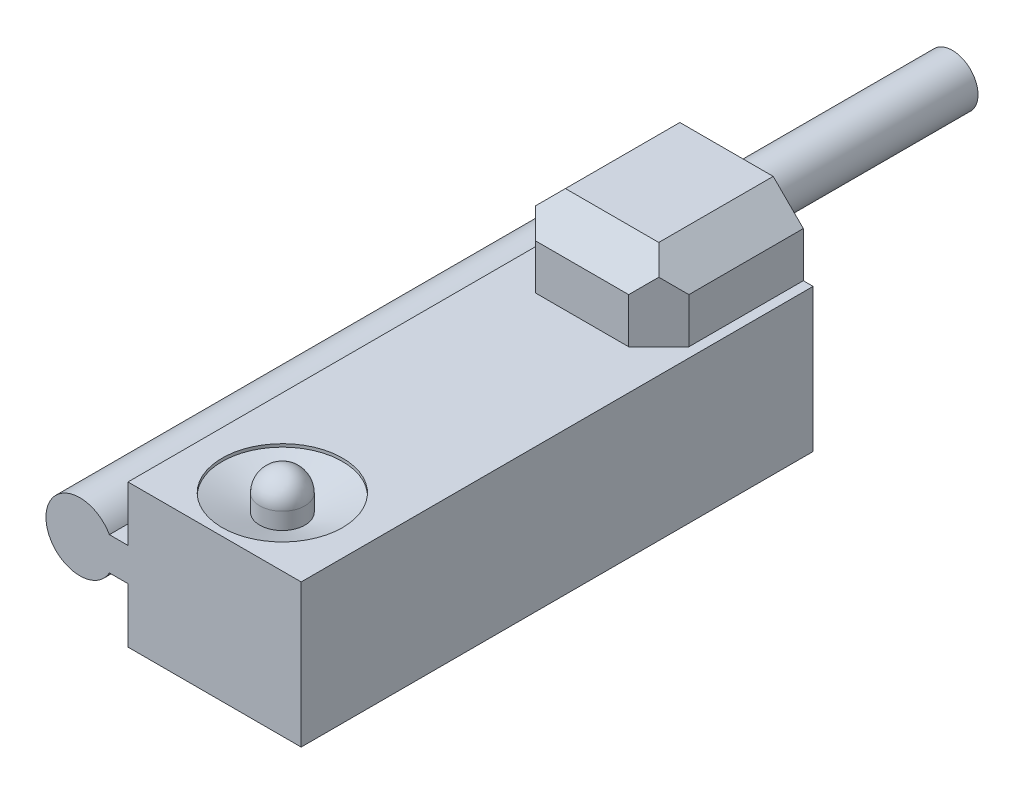
ISO-10303-21;
HEADER;
FILE_DESCRIPTION(('STEP AP214'),'2;1');
FILE_NAME('part.step','',(''),(''),'','','');
FILE_SCHEMA(('AUTOMOTIVE_DESIGN { 1 0 10303 214 1 1 1 1 }'));
ENDSEC;
DATA;
#1=APPLICATION_CONTEXT('core data for automotive mechanical design processes');
#2=APPLICATION_PROTOCOL_DEFINITION('international standard','automotive_design',2000,#1);
#3=PRODUCT_CONTEXT('',#1,'mechanical');
#4=PRODUCT('Part','Part','',(#3));
#5=PRODUCT_RELATED_PRODUCT_CATEGORY('part','',(#4));
#6=PRODUCT_DEFINITION_FORMATION('','',#4);
#7=PRODUCT_DEFINITION_CONTEXT('part definition',#1,'design');
#8=PRODUCT_DEFINITION('design','',#6,#7);
#9=PRODUCT_DEFINITION_SHAPE('','',#8);
#10=(LENGTH_UNIT() NAMED_UNIT(*) SI_UNIT(.MILLI.,.METRE.));
#11=(NAMED_UNIT(*) PLANE_ANGLE_UNIT() SI_UNIT($,.RADIAN.));
#12=(NAMED_UNIT(*) SI_UNIT($,.STERADIAN.) SOLID_ANGLE_UNIT());
#13=UNCERTAINTY_MEASURE_WITH_UNIT(LENGTH_MEASURE(1.E-05),#10,'distance_accuracy_value','');
#14=(GEOMETRIC_REPRESENTATION_CONTEXT(3) GLOBAL_UNCERTAINTY_ASSIGNED_CONTEXT((#13)) GLOBAL_UNIT_ASSIGNED_CONTEXT((#10,
#11,#12)) REPRESENTATION_CONTEXT('',''));
#15=CARTESIAN_POINT('',(0.,0.,0.));
#16=DIRECTION('',(0.,0.,1.));
#17=DIRECTION('',(1.,0.,0.));
#18=AXIS2_PLACEMENT_3D('',#15,#16,#17);
#19=CARTESIAN_POINT('',(-3.025,2.25,24.5));
#20=DIRECTION('',(0.,-1.,0.));
#21=DIRECTION('',(0.,0.,-1.));
#22=AXIS2_PLACEMENT_3D('',#19,#20,#21);
#23=PLANE('',#22);
#24=CARTESIAN_POINT('',(2.725,2.25,20.));
#25=DIRECTION('',(0.,-1.,0.));
#26=DIRECTION('',(0.,0.,-1.));
#27=AXIS2_PLACEMENT_3D('',#24,#25,#26);
#28=CIRCLE('',#27,4.);
#29=CARTESIAN_POINT('',(6.725,2.25,20.));
#30=VERTEX_POINT('',#29);
#31=EDGE_CURVE('E248',#30,#30,#28,.T.);
#32=ORIENTED_EDGE('',*,*,#31,.T.);
#33=EDGE_LOOP('',(#32));
#34=FACE_BOUND('',#33,.T.);
#35=DIRECTION('',(0.,0.,1.));
#36=VECTOR('',#35,1.);
#37=CARTESIAN_POINT('',(-2.375,2.25,-9.5));
#38=LINE('',#37,#36);
#39=CARTESIAN_POINT('',(-2.375,2.25,-9.5));
#40=VERTEX_POINT('',#39);
#41=CARTESIAN_POINT('',(-2.375,2.25,-1.9));
#42=VERTEX_POINT('',#41);
#43=EDGE_CURVE('E267',#40,#42,#38,.T.);
#44=ORIENTED_EDGE('',*,*,#43,.F.);
#45=DIRECTION('',(-1.,0.,0.));
#46=VECTOR('',#45,1.);
#47=CARTESIAN_POINT('',(-3.025,2.25,-9.5));
#48=LINE('',#47,#46);
#49=CARTESIAN_POINT('',(-3.025,2.25,-9.5));
#50=VERTEX_POINT('',#49);
#51=EDGE_CURVE('E289',#40,#50,#48,.T.);
#52=ORIENTED_EDGE('',*,*,#51,.T.);
#53=DIRECTION('',(0.,0.,-1.));
#54=VECTOR('',#53,1.);
#55=CARTESIAN_POINT('',(-3.025,2.25,24.5));
#56=LINE('',#55,#54);
#57=CARTESIAN_POINT('',(-3.025,2.25,24.5));
#58=VERTEX_POINT('',#57);
#59=EDGE_CURVE('E11',#58,#50,#56,.T.);
#60=ORIENTED_EDGE('',*,*,#59,.F.);
#61=DIRECTION('',(-1.,0.,0.));
#62=VECTOR('',#61,1.);
#63=CARTESIAN_POINT('',(-3.025,2.25,24.5));
#64=LINE('',#63,#62);
#65=CARTESIAN_POINT('',(8.475,2.25,24.5));
#66=VERTEX_POINT('',#65);
#67=EDGE_CURVE('E335',#66,#58,#64,.T.);
#68=ORIENTED_EDGE('',*,*,#67,.F.);
#69=DIRECTION('',(0.,0.,-1.));
#70=VECTOR('',#69,1.);
#71=CARTESIAN_POINT('',(8.475,2.25,24.5));
#72=LINE('',#71,#70);
#73=CARTESIAN_POINT('',(8.475,2.25,-9.5));
#74=VERTEX_POINT('',#73);
#75=EDGE_CURVE('E45',#66,#74,#72,.T.);
#76=ORIENTED_EDGE('',*,*,#75,.T.);
#77=DIRECTION('',(-1.,0.,0.));
#78=VECTOR('',#77,1.);
#79=CARTESIAN_POINT('',(-3.025,2.25,-9.5));
#80=LINE('',#79,#78);
#81=CARTESIAN_POINT('',(7.825,2.25,-9.5));
#82=VERTEX_POINT('',#81);
#83=EDGE_CURVE('E191',#74,#82,#80,.T.);
#84=ORIENTED_EDGE('',*,*,#83,.T.);
#85=DIRECTION('',(0.,0.,-1.));
#86=VECTOR('',#85,1.);
#87=CARTESIAN_POINT('',(7.825,2.25,-9.5));
#88=LINE('',#87,#86);
#89=CARTESIAN_POINT('',(7.825,2.25,-1.9));
#90=VERTEX_POINT('',#89);
#91=EDGE_CURVE('E177',#90,#82,#88,.T.);
#92=ORIENTED_EDGE('',*,*,#91,.F.);
#93=DIRECTION('',(-0.707106781186548,0.,0.707106781186547));
#94=VECTOR('',#93,1.);
#95=CARTESIAN_POINT('',(-10.8,2.25,16.725));
#96=LINE('',#95,#94);
#97=CARTESIAN_POINT('',(5.825,2.25,0.1));
#98=VERTEX_POINT('',#97);
#99=EDGE_CURVE('E504',#90,#98,#96,.T.);
#100=ORIENTED_EDGE('',*,*,#99,.T.);
#101=DIRECTION('',(1.,0.,0.));
#102=VECTOR('',#101,1.);
#103=CARTESIAN_POINT('',(-2.375,2.25,0.1));
#104=LINE('',#103,#102);
#105=CARTESIAN_POINT('',(-0.375,2.25,0.1));
#106=VERTEX_POINT('',#105);
#107=EDGE_CURVE('E164',#106,#98,#104,.T.);
#108=ORIENTED_EDGE('',*,*,#107,.F.);
#109=DIRECTION('',(-0.707106781186547,0.,-0.707106781186548));
#110=VECTOR('',#109,1.);
#111=CARTESIAN_POINT('',(10.5,2.25,10.975));
#112=LINE('',#111,#110);
#113=EDGE_CURVE('E222',#106,#42,#112,.T.);
#114=ORIENTED_EDGE('',*,*,#113,.T.);
#115=EDGE_LOOP('',(#44,#52,#60,#68,#76,#84,#92,#100,#108,#114));
#116=FACE_BOUND('',#115,.T.);
#117=ADVANCED_FACE('F19',(#34,#116),#23,.F.);
#118=CARTESIAN_POINT('',(-4.26222135736095,-1.4,24.5));
#119=DIRECTION('',(0.,-1.,0.));
#120=DIRECTION('',(0.,0.,-1.));
#121=AXIS2_PLACEMENT_3D('',#118,#119,#120);
#122=PLANE('',#121);
#123=DIRECTION('',(1.,0.,0.));
#124=VECTOR('',#123,1.);
#125=CARTESIAN_POINT('',(-3.025,-1.4,19.5));
#126=LINE('',#125,#124);
#127=CARTESIAN_POINT('',(-4.26222135736095,-1.4,19.5));
#128=VERTEX_POINT('',#127);
#129=CARTESIAN_POINT('',(-3.025,-1.4,19.5));
#130=VERTEX_POINT('',#129);
#131=EDGE_CURVE('E257',#128,#130,#126,.T.);
#132=ORIENTED_EDGE('',*,*,#131,.F.);
#133=DIRECTION('',(0.,0.,-1.));
#134=VECTOR('',#133,1.);
#135=CARTESIAN_POINT('',(-4.26222135736095,-1.4,24.5));
#136=LINE('',#135,#134);
#137=CARTESIAN_POINT('',(-4.26222135736095,-1.4,24.5));
#138=VERTEX_POINT('',#137);
#139=EDGE_CURVE('E241',#138,#128,#136,.T.);
#140=ORIENTED_EDGE('',*,*,#139,.F.);
#141=DIRECTION('',(-1.,0.,0.));
#142=VECTOR('',#141,1.);
#143=CARTESIAN_POINT('',(-4.26222135736095,-1.4,24.5));
#144=LINE('',#143,#142);
#145=CARTESIAN_POINT('',(-3.025,-1.4,24.5));
#146=VERTEX_POINT('',#145);
#147=EDGE_CURVE('E330',#146,#138,#144,.T.);
#148=ORIENTED_EDGE('',*,*,#147,.F.);
#149=DIRECTION('',(0.,0.,-1.));
#150=VECTOR('',#149,1.);
#151=CARTESIAN_POINT('',(-3.025,-1.4,24.5));
#152=LINE('',#151,#150);
#153=EDGE_CURVE('E30',#146,#130,#152,.T.);
#154=ORIENTED_EDGE('',*,*,#153,.T.);
#155=EDGE_LOOP('',(#132,#140,#148,#154));
#156=FACE_BOUND('',#155,.T.);
#157=ADVANCED_FACE('F455',(#156),#122,.F.);
#158=CARTESIAN_POINT('',(-3.025,-3.6,24.5));
#159=DIRECTION('',(0.,1.,0.));
#160=DIRECTION('',(1.,0.,0.));
#161=AXIS2_PLACEMENT_3D('',#158,#159,#160);
#162=PLANE('',#161);
#163=DIRECTION('',(-1.,0.,0.));
#164=VECTOR('',#163,1.);
#165=CARTESIAN_POINT('',(-4.26222135736095,-3.6,19.5));
#166=LINE('',#165,#164);
#167=CARTESIAN_POINT('',(-3.025,-3.6,19.5));
#168=VERTEX_POINT('',#167);
#169=CARTESIAN_POINT('',(-4.26222135736095,-3.6,19.5));
#170=VERTEX_POINT('',#169);
#171=EDGE_CURVE('E390',#168,#170,#166,.T.);
#172=ORIENTED_EDGE('',*,*,#171,.F.);
#173=DIRECTION('',(0.,0.,-1.));
#174=VECTOR('',#173,1.);
#175=CARTESIAN_POINT('',(-3.025,-3.6,24.5));
#176=LINE('',#175,#174);
#177=CARTESIAN_POINT('',(-3.025,-3.6,24.5));
#178=VERTEX_POINT('',#177);
#179=EDGE_CURVE('E294',#178,#168,#176,.T.);
#180=ORIENTED_EDGE('',*,*,#179,.F.);
#181=DIRECTION('',(1.,0.,0.));
#182=VECTOR('',#181,1.);
#183=CARTESIAN_POINT('',(-3.025,-3.6,24.5));
#184=LINE('',#183,#182);
#185=CARTESIAN_POINT('',(-4.26222135736095,-3.6,24.5));
#186=VERTEX_POINT('',#185);
#187=EDGE_CURVE('E325',#186,#178,#184,.T.);
#188=ORIENTED_EDGE('',*,*,#187,.F.);
#189=DIRECTION('',(0.,0.,-1.));
#190=VECTOR('',#189,1.);
#191=CARTESIAN_POINT('',(-4.26222135736095,-3.6,24.5));
#192=LINE('',#191,#190);
#193=EDGE_CURVE('E240',#186,#170,#192,.T.);
#194=ORIENTED_EDGE('',*,*,#193,.T.);
#195=EDGE_LOOP('',(#172,#180,#188,#194));
#196=FACE_BOUND('',#195,.T.);
#197=ADVANCED_FACE('F420',(#196),#162,.F.);
#198=CARTESIAN_POINT('',(-3.025,-3.6,24.5));
#199=DIRECTION('',(1.,0.,0.));
#200=DIRECTION('',(0.,1.,0.));
#201=AXIS2_PLACEMENT_3D('',#198,#199,#200);
#202=PLANE('',#201);
#203=DIRECTION('',(0.,-1.,0.));
#204=VECTOR('',#203,1.);
#205=CARTESIAN_POINT('',(-3.025,2.25,-9.5));
#206=LINE('',#205,#204);
#207=CARTESIAN_POINT('',(-3.025,-1.4,-9.5));
#208=VERTEX_POINT('',#207);
#209=EDGE_CURVE('E256',#50,#208,#206,.T.);
#210=ORIENTED_EDGE('',*,*,#209,.T.);
#211=DIRECTION('',(0.,0.,-1.));
#212=VECTOR('',#211,1.);
#213=CARTESIAN_POINT('',(-3.025,-1.4,24.5));
#214=LINE('',#213,#212);
#215=CARTESIAN_POINT('',(-3.025,-1.4,-4.5));
#216=VERTEX_POINT('',#215);
#217=EDGE_CURVE('E355',#216,#208,#214,.T.);
#218=ORIENTED_EDGE('',*,*,#217,.F.);
#219=DIRECTION('',(0.,-1.,0.));
#220=VECTOR('',#219,1.);
#221=CARTESIAN_POINT('',(-3.025,-3.6,-4.5));
#222=LINE('',#221,#220);
#223=CARTESIAN_POINT('',(-3.025,-3.6,-4.5));
#224=VERTEX_POINT('',#223);
#225=EDGE_CURVE('E334',#216,#224,#222,.T.);
#226=ORIENTED_EDGE('',*,*,#225,.T.);
#227=DIRECTION('',(0.,0.,-1.));
#228=VECTOR('',#227,1.);
#229=CARTESIAN_POINT('',(-3.025,-3.6,24.5));
#230=LINE('',#229,#228);
#231=CARTESIAN_POINT('',(-3.025,-3.6,-9.5));
#232=VERTEX_POINT('',#231);
#233=EDGE_CURVE('E303',#224,#232,#230,.T.);
#234=ORIENTED_EDGE('',*,*,#233,.T.);
#235=DIRECTION('',(0.,-1.,0.));
#236=VECTOR('',#235,1.);
#237=CARTESIAN_POINT('',(-3.025,-7.25,-9.5));
#238=LINE('',#237,#236);
#239=CARTESIAN_POINT('',(-3.025,-7.25,-9.5));
#240=VERTEX_POINT('',#239);
#241=EDGE_CURVE('E252',#232,#240,#238,.T.);
#242=ORIENTED_EDGE('',*,*,#241,.T.);
#243=DIRECTION('',(0.,0.,-1.));
#244=VECTOR('',#243,1.);
#245=CARTESIAN_POINT('',(-3.025,-7.25,24.5));
#246=LINE('',#245,#244);
#247=CARTESIAN_POINT('',(-3.025,-7.25,24.5));
#248=VERTEX_POINT('',#247);
#249=EDGE_CURVE('E308',#248,#240,#246,.T.);
#250=ORIENTED_EDGE('',*,*,#249,.F.);
#251=DIRECTION('',(0.,-1.,0.));
#252=VECTOR('',#251,1.);
#253=CARTESIAN_POINT('',(-3.025,-7.25,24.5));
#254=LINE('',#253,#252);
#255=EDGE_CURVE('E329',#178,#248,#254,.T.);
#256=ORIENTED_EDGE('',*,*,#255,.F.);
#257=ORIENTED_EDGE('',*,*,#179,.T.);
#258=DIRECTION('',(0.,-1.,0.));
#259=VECTOR('',#258,1.);
#260=CARTESIAN_POINT('',(-3.025,-3.6,19.5));
#261=LINE('',#260,#259);
#262=EDGE_CURVE('E261',#130,#168,#261,.T.);
#263=ORIENTED_EDGE('',*,*,#262,.F.);
#264=ORIENTED_EDGE('',*,*,#153,.F.);
#265=DIRECTION('',(0.,-1.,0.));
#266=VECTOR('',#265,1.);
#267=CARTESIAN_POINT('',(-3.025,2.25,24.5));
#268=LINE('',#267,#266);
#269=EDGE_CURVE('E439',#58,#146,#268,.T.);
#270=ORIENTED_EDGE('',*,*,#269,.F.);
#271=ORIENTED_EDGE('',*,*,#59,.T.);
#272=EDGE_LOOP('',(#210,#218,#226,#234,#242,#250,#256,#257,#263,#264,#270,#271));
#273=FACE_BOUND('',#272,.T.);
#274=ADVANCED_FACE('F428',(#273),#202,.F.);
#275=CARTESIAN_POINT('',(8.475,2.25,24.5));
#276=DIRECTION('',(-1.,0.,0.));
#277=DIRECTION('',(0.,1.,0.));
#278=AXIS2_PLACEMENT_3D('',#275,#276,#277);
#279=PLANE('',#278);
#280=DIRECTION('',(0.,1.,0.));
#281=VECTOR('',#280,1.);
#282=CARTESIAN_POINT('',(8.475,2.25,24.5));
#283=LINE('',#282,#281);
#284=CARTESIAN_POINT('',(8.475,-7.25,24.5));
#285=VERTEX_POINT('',#284);
#286=EDGE_CURVE('E339',#285,#66,#283,.T.);
#287=ORIENTED_EDGE('',*,*,#286,.F.);
#288=DIRECTION('',(0.,0.,-1.));
#289=VECTOR('',#288,1.);
#290=CARTESIAN_POINT('',(8.475,-7.25,24.5));
#291=LINE('',#290,#289);
#292=CARTESIAN_POINT('',(8.475,-7.25,-9.5));
#293=VERTEX_POINT('',#292);
#294=EDGE_CURVE('E324',#285,#293,#291,.T.);
#295=ORIENTED_EDGE('',*,*,#294,.T.);
#296=DIRECTION('',(0.,1.,0.));
#297=VECTOR('',#296,1.);
#298=CARTESIAN_POINT('',(8.475,2.25,-9.5));
#299=LINE('',#298,#297);
#300=EDGE_CURVE('E196',#293,#74,#299,.T.);
#301=ORIENTED_EDGE('',*,*,#300,.T.);
#302=ORIENTED_EDGE('',*,*,#75,.F.);
#303=EDGE_LOOP('',(#287,#295,#301,#302));
#304=FACE_BOUND('',#303,.T.);
#305=ADVANCED_FACE('F441',(#304),#279,.F.);
#306=CARTESIAN_POINT('',(-6.225,-2.5,24.5));
#307=DIRECTION('',(0.,0.,1.));
#308=DIRECTION('',(1.,0.,0.));
#309=AXIS2_PLACEMENT_3D('',#306,#307,#308);
#310=PLANE('',#309);
#311=ORIENTED_EDGE('',*,*,#269,.T.);
#312=ORIENTED_EDGE('',*,*,#147,.T.);
#313=CARTESIAN_POINT('',(-6.225,-2.5,24.5));
#314=DIRECTION('',(0.,0.,1.));
#315=DIRECTION('',(1.,0.,0.));
#316=AXIS2_PLACEMENT_3D('',#313,#314,#315);
#317=CIRCLE('',#316,2.25);
#318=EDGE_CURVE('E279',#138,#186,#317,.T.);
#319=ORIENTED_EDGE('',*,*,#318,.T.);
#320=ORIENTED_EDGE('',*,*,#187,.T.);
#321=ORIENTED_EDGE('',*,*,#255,.T.);
#322=DIRECTION('',(1.,0.,0.));
#323=VECTOR('',#322,1.);
#324=CARTESIAN_POINT('',(8.475,-7.25,24.5));
#325=LINE('',#324,#323);
#326=EDGE_CURVE('E320',#248,#285,#325,.T.);
#327=ORIENTED_EDGE('',*,*,#326,.T.);
#328=ORIENTED_EDGE('',*,*,#286,.T.);
#329=ORIENTED_EDGE('',*,*,#67,.T.);
#330=EDGE_LOOP('',(#311,#312,#319,#320,#321,#327,#328,#329));
#331=FACE_BOUND('',#330,.T.);
#332=ADVANCED_FACE('F438',(#331),#310,.T.);
#333=CARTESIAN_POINT('',(-6.225,-2.5,-9.5));
#334=DIRECTION('',(0.,0.,1.));
#335=DIRECTION('',(1.,0.,0.));
#336=AXIS2_PLACEMENT_3D('',#333,#334,#335);
#337=PLANE('',#336);
#338=CARTESIAN_POINT('',(2.725,3.75,-9.5));
#339=DIRECTION('',(0.,0.,-1.));
#340=DIRECTION('',(1.,0.,0.));
#341=AXIS2_PLACEMENT_3D('',#338,#339,#340);
#342=CIRCLE('',#341,1.7);
#343=CARTESIAN_POINT('',(4.425,3.75,-9.5));
#344=VERTEX_POINT('',#343);
#345=EDGE_CURVE('E228',#344,#344,#342,.T.);
#346=ORIENTED_EDGE('',*,*,#345,.F.);
#347=EDGE_LOOP('',(#346));
#348=FACE_BOUND('',#347,.T.);
#349=DIRECTION('',(-1.,0.,0.));
#350=VECTOR('',#349,1.);
#351=CARTESIAN_POINT('',(-2.375,7.25,-9.5));
#352=LINE('',#351,#350);
#353=CARTESIAN_POINT('',(5.825,7.25,-9.5));
#354=VERTEX_POINT('',#353);
#355=CARTESIAN_POINT('',(-0.375,7.25,-9.5));
#356=VERTEX_POINT('',#355);
#357=EDGE_CURVE('E215',#354,#356,#352,.T.);
#358=ORIENTED_EDGE('',*,*,#357,.F.);
#359=DIRECTION('',(0.707106781186547,-0.707106781186548,0.));
#360=VECTOR('',#359,1.);
#361=CARTESIAN_POINT('',(5.825,7.25,-9.5));
#362=LINE('',#361,#360);
#363=CARTESIAN_POINT('',(7.825,5.25,-9.5));
#364=VERTEX_POINT('',#363);
#365=EDGE_CURVE('E212',#354,#364,#362,.T.);
#366=ORIENTED_EDGE('',*,*,#365,.T.);
#367=DIRECTION('',(0.,-1.,0.));
#368=VECTOR('',#367,1.);
#369=CARTESIAN_POINT('',(7.825,7.25,-9.5));
#370=LINE('',#369,#368);
#371=EDGE_CURVE('E204',#364,#82,#370,.T.);
#372=ORIENTED_EDGE('',*,*,#371,.T.);
#373=ORIENTED_EDGE('',*,*,#83,.F.);
#374=ORIENTED_EDGE('',*,*,#300,.F.);
#375=DIRECTION('',(1.,0.,0.));
#376=VECTOR('',#375,1.);
#377=CARTESIAN_POINT('',(8.475,-7.25,-9.5));
#378=LINE('',#377,#376);
#379=EDGE_CURVE('E367',#240,#293,#378,.T.);
#380=ORIENTED_EDGE('',*,*,#379,.F.);
#381=ORIENTED_EDGE('',*,*,#241,.F.);
#382=DIRECTION('',(1.,0.,0.));
#383=VECTOR('',#382,1.);
#384=CARTESIAN_POINT('',(-3.025,-3.6,-9.5));
#385=LINE('',#384,#383);
#386=CARTESIAN_POINT('',(-4.26222135736095,-3.6,-9.5));
#387=VERTEX_POINT('',#386);
#388=EDGE_CURVE('E307',#387,#232,#385,.T.);
#389=ORIENTED_EDGE('',*,*,#388,.F.);
#390=CARTESIAN_POINT('',(-6.225,-2.5,-9.5));
#391=DIRECTION('',(0.,0.,1.));
#392=DIRECTION('',(1.,0.,0.));
#393=AXIS2_PLACEMENT_3D('',#390,#391,#392);
#394=CIRCLE('',#393,2.25);
#395=CARTESIAN_POINT('',(-4.26222135736095,-1.4,-9.5));
#396=VERTEX_POINT('',#395);
#397=EDGE_CURVE('E349',#396,#387,#394,.T.);
#398=ORIENTED_EDGE('',*,*,#397,.F.);
#399=DIRECTION('',(-1.,0.,0.));
#400=VECTOR('',#399,1.);
#401=CARTESIAN_POINT('',(-4.26222135736095,-1.4,-9.5));
#402=LINE('',#401,#400);
#403=EDGE_CURVE('E197',#208,#396,#402,.T.);
#404=ORIENTED_EDGE('',*,*,#403,.F.);
#405=ORIENTED_EDGE('',*,*,#209,.F.);
#406=ORIENTED_EDGE('',*,*,#51,.F.);
#407=DIRECTION('',(0.,-1.,0.));
#408=VECTOR('',#407,1.);
#409=CARTESIAN_POINT('',(-2.375,7.25,-9.5));
#410=LINE('',#409,#408);
#411=CARTESIAN_POINT('',(-2.375,5.25,-9.5));
#412=VERTEX_POINT('',#411);
#413=EDGE_CURVE('E263',#412,#40,#410,.T.);
#414=ORIENTED_EDGE('',*,*,#413,.F.);
#415=DIRECTION('',(0.707106781186547,0.707106781186548,0.));
#416=VECTOR('',#415,1.);
#417=CARTESIAN_POINT('',(-0.375,7.25,-9.5));
#418=LINE('',#417,#416);
#419=EDGE_CURVE('E311',#412,#356,#418,.T.);
#420=ORIENTED_EDGE('',*,*,#419,.T.);
#421=EDGE_LOOP('',(#358,#366,#372,#373,#374,#380,#381,#389,#398,#404,#405,#406,#414,#420));
#422=FACE_BOUND('',#421,.T.);
#423=ADVANCED_FACE('F210',(#348,#422),#337,.F.);
#424=CARTESIAN_POINT('',(-4.26222135736095,-1.4,24.5));
#425=DIRECTION('',(0.,-1.,0.));
#426=DIRECTION('',(0.,0.,-1.));
#427=AXIS2_PLACEMENT_3D('',#424,#425,#426);
#428=PLANE('',#427);
#429=DIRECTION('',(0.,0.,-1.));
#430=VECTOR('',#429,1.);
#431=CARTESIAN_POINT('',(-4.26222135736095,-1.4,24.5));
#432=LINE('',#431,#430);
#433=CARTESIAN_POINT('',(-4.26222135736095,-1.4,-4.5));
#434=VERTEX_POINT('',#433);
#435=EDGE_CURVE('E226',#434,#396,#432,.T.);
#436=ORIENTED_EDGE('',*,*,#435,.F.);
#437=DIRECTION('',(1.,0.,0.));
#438=VECTOR('',#437,1.);
#439=CARTESIAN_POINT('',(-3.025,-1.4,-4.5));
#440=LINE('',#439,#438);
#441=EDGE_CURVE('E262',#434,#216,#440,.T.);
#442=ORIENTED_EDGE('',*,*,#441,.T.);
#443=ORIENTED_EDGE('',*,*,#217,.T.);
#444=ORIENTED_EDGE('',*,*,#403,.T.);
#445=EDGE_LOOP('',(#436,#442,#443,#444));
#446=FACE_BOUND('',#445,.T.);
#447=ADVANCED_FACE('F448',(#446),#428,.F.);
#448=CARTESIAN_POINT('',(-3.025,-3.6,24.5));
#449=DIRECTION('',(0.,1.,0.));
#450=DIRECTION('',(1.,0.,0.));
#451=AXIS2_PLACEMENT_3D('',#448,#449,#450);
#452=PLANE('',#451);
#453=ORIENTED_EDGE('',*,*,#233,.F.);
#454=DIRECTION('',(-1.,0.,0.));
#455=VECTOR('',#454,1.);
#456=CARTESIAN_POINT('',(-4.26222135736095,-3.6,-4.5));
#457=LINE('',#456,#455);
#458=CARTESIAN_POINT('',(-4.26222135736095,-3.6,-4.5));
#459=VERTEX_POINT('',#458);
#460=EDGE_CURVE('E331',#224,#459,#457,.T.);
#461=ORIENTED_EDGE('',*,*,#460,.T.);
#462=DIRECTION('',(0.,0.,-1.));
#463=VECTOR('',#462,1.);
#464=CARTESIAN_POINT('',(-4.26222135736095,-3.6,24.5));
#465=LINE('',#464,#463);
#466=EDGE_CURVE('E319',#459,#387,#465,.T.);
#467=ORIENTED_EDGE('',*,*,#466,.T.);
#468=ORIENTED_EDGE('',*,*,#388,.T.);
#469=EDGE_LOOP('',(#453,#461,#467,#468));
#470=FACE_BOUND('',#469,.T.);
#471=ADVANCED_FACE('F467',(#470),#452,.F.);
#472=CARTESIAN_POINT('',(8.475,-7.25,24.5));
#473=DIRECTION('',(0.,1.,0.));
#474=DIRECTION('',(1.,0.,0.));
#475=AXIS2_PLACEMENT_3D('',#472,#473,#474);
#476=PLANE('',#475);
#477=ORIENTED_EDGE('',*,*,#379,.T.);
#478=ORIENTED_EDGE('',*,*,#294,.F.);
#479=ORIENTED_EDGE('',*,*,#326,.F.);
#480=ORIENTED_EDGE('',*,*,#249,.T.);
#481=EDGE_LOOP('',(#477,#478,#479,#480));
#482=FACE_BOUND('',#481,.T.);
#483=ADVANCED_FACE('F470',(#482),#476,.F.);
#484=CARTESIAN_POINT('',(-6.225,-2.5,19.5));
#485=DIRECTION('',(0.,0.,-1.));
#486=DIRECTION('',(0.,-1.,0.));
#487=AXIS2_PLACEMENT_3D('',#484,#485,#486);
#488=PLANE('',#487);
#489=CARTESIAN_POINT('',(-6.225,-2.5,19.5));
#490=DIRECTION('',(0.,0.,1.));
#491=DIRECTION('',(-1.,0.,0.));
#492=AXIS2_PLACEMENT_3D('',#489,#490,#491);
#493=CIRCLE('',#492,2.25);
#494=EDGE_CURVE('E236',#170,#128,#493,.T.);
#495=ORIENTED_EDGE('',*,*,#494,.T.);
#496=ORIENTED_EDGE('',*,*,#131,.T.);
#497=ORIENTED_EDGE('',*,*,#262,.T.);
#498=ORIENTED_EDGE('',*,*,#171,.T.);
#499=EDGE_LOOP('',(#495,#496,#497,#498));
#500=FACE_BOUND('',#499,.T.);
#501=ADVANCED_FACE('F423',(#500),#488,.T.);
#502=CARTESIAN_POINT('',(-6.225,-2.5,-4.5));
#503=DIRECTION('',(0.,0.,-1.));
#504=DIRECTION('',(0.,-1.,0.));
#505=AXIS2_PLACEMENT_3D('',#502,#503,#504);
#506=PLANE('',#505);
#507=CARTESIAN_POINT('',(-6.225,-2.5,-4.5));
#508=DIRECTION('',(0.,0.,1.));
#509=DIRECTION('',(-1.,0.,0.));
#510=AXIS2_PLACEMENT_3D('',#507,#508,#509);
#511=CIRCLE('',#510,2.25);
#512=EDGE_CURVE('E315',#459,#434,#511,.T.);
#513=ORIENTED_EDGE('',*,*,#512,.F.);
#514=ORIENTED_EDGE('',*,*,#460,.F.);
#515=ORIENTED_EDGE('',*,*,#225,.F.);
#516=ORIENTED_EDGE('',*,*,#441,.F.);
#517=EDGE_LOOP('',(#513,#514,#515,#516));
#518=FACE_BOUND('',#517,.T.);
#519=ADVANCED_FACE('F771',(#518),#506,.F.);
#520=CARTESIAN_POINT('',(2.725,2.25,20.));
#521=DIRECTION('',(0.,-1.,0.));
#522=DIRECTION('',(0.,0.,1.));
#523=AXIS2_PLACEMENT_3D('',#520,#521,#522);
#524=SPHERICAL_SURFACE('',#523,1.5);
#525=CARTESIAN_POINT('',(2.725,2.25,20.));
#526=DIRECTION('',(0.,-1.,0.));
#527=DIRECTION('',(0.,0.,1.));
#528=AXIS2_PLACEMENT_3D('',#525,#526,#527);
#529=CIRCLE('',#528,1.5);
#530=CARTESIAN_POINT('',(2.725,2.25,21.5));
#531=VERTEX_POINT('',#530);
#532=EDGE_CURVE('E272',#531,#531,#529,.T.);
#533=ORIENTED_EDGE('',*,*,#532,.F.);
#534=EDGE_LOOP('',(#533));
#535=FACE_BOUND('',#534,.T.);
#536=ADVANCED_FACE('F465',(#535),#524,.T.);
#537=CARTESIAN_POINT('',(-2.375,7.25,-9.5));
#538=DIRECTION('',(1.,0.,0.));
#539=DIRECTION('',(0.,1.,0.));
#540=AXIS2_PLACEMENT_3D('',#537,#538,#539);
#541=PLANE('',#540);
#542=DIRECTION('',(0.,1.,0.));
#543=VECTOR('',#542,1.);
#544=CARTESIAN_POINT('',(-2.375,7.25,-1.9));
#545=LINE('',#544,#543);
#546=CARTESIAN_POINT('',(-2.375,5.25,-1.9));
#547=VERTEX_POINT('',#546);
#548=EDGE_CURVE('E235',#42,#547,#545,.T.);
#549=ORIENTED_EDGE('',*,*,#548,.T.);
#550=DIRECTION('',(0.,0.,-1.));
#551=VECTOR('',#550,1.);
#552=CARTESIAN_POINT('',(-2.375,5.25,-9.5));
#553=LINE('',#552,#551);
#554=EDGE_CURVE('E242',#547,#412,#553,.T.);
#555=ORIENTED_EDGE('',*,*,#554,.T.);
#556=ORIENTED_EDGE('',*,*,#413,.T.);
#557=ORIENTED_EDGE('',*,*,#43,.T.);
#558=EDGE_LOOP('',(#549,#555,#556,#557));
#559=FACE_BOUND('',#558,.T.);
#560=ADVANCED_FACE('F731',(#559),#541,.F.);
#561=CARTESIAN_POINT('',(-2.375,7.25,0.1));
#562=DIRECTION('',(0.,0.,-1.));
#563=DIRECTION('',(0.,-1.,0.));
#564=AXIS2_PLACEMENT_3D('',#561,#562,#563);
#565=PLANE('',#564);
#566=DIRECTION('',(0.,1.,0.));
#567=VECTOR('',#566,1.);
#568=CARTESIAN_POINT('',(5.825,7.25,0.1));
#569=LINE('',#568,#567);
#570=CARTESIAN_POINT('',(5.825,5.25,0.1));
#571=VERTEX_POINT('',#570);
#572=EDGE_CURVE('E401',#98,#571,#569,.T.);
#573=ORIENTED_EDGE('',*,*,#572,.T.);
#574=DIRECTION('',(-1.,0.,0.));
#575=VECTOR('',#574,1.);
#576=CARTESIAN_POINT('',(-0.375,5.25,0.1));
#577=LINE('',#576,#575);
#578=CARTESIAN_POINT('',(-0.375,5.25,0.1));
#579=VERTEX_POINT('',#578);
#580=EDGE_CURVE('E280',#571,#579,#577,.T.);
#581=ORIENTED_EDGE('',*,*,#580,.T.);
#582=DIRECTION('',(0.,-1.,0.));
#583=VECTOR('',#582,1.);
#584=CARTESIAN_POINT('',(-0.375,7.25,0.1));
#585=LINE('',#584,#583);
#586=EDGE_CURVE('E501',#579,#106,#585,.T.);
#587=ORIENTED_EDGE('',*,*,#586,.T.);
#588=ORIENTED_EDGE('',*,*,#107,.T.);
#589=EDGE_LOOP('',(#573,#581,#587,#588));
#590=FACE_BOUND('',#589,.T.);
#591=ADVANCED_FACE('F500',(#590),#565,.F.);
#592=CARTESIAN_POINT('',(7.825,7.25,-9.5));
#593=DIRECTION('',(-1.,0.,0.));
#594=DIRECTION('',(0.,0.,1.));
#595=AXIS2_PLACEMENT_3D('',#592,#593,#594);
#596=PLANE('',#595);
#597=ORIENTED_EDGE('',*,*,#371,.F.);
#598=DIRECTION('',(0.,0.,1.));
#599=VECTOR('',#598,1.);
#600=CARTESIAN_POINT('',(7.825,5.25,-1.9));
#601=LINE('',#600,#599);
#602=CARTESIAN_POINT('',(7.825,5.25,-1.9));
#603=VERTEX_POINT('',#602);
#604=EDGE_CURVE('E271',#364,#603,#601,.T.);
#605=ORIENTED_EDGE('',*,*,#604,.T.);
#606=DIRECTION('',(0.,-1.,0.));
#607=VECTOR('',#606,1.);
#608=CARTESIAN_POINT('',(7.825,7.25,-1.9));
#609=LINE('',#608,#607);
#610=EDGE_CURVE('E207',#603,#90,#609,.T.);
#611=ORIENTED_EDGE('',*,*,#610,.T.);
#612=ORIENTED_EDGE('',*,*,#91,.T.);
#613=EDGE_LOOP('',(#597,#605,#611,#612));
#614=FACE_BOUND('',#613,.T.);
#615=ADVANCED_FACE('F202',(#614),#596,.F.);
#616=CARTESIAN_POINT('',(-6.225,7.25,-9.5));
#617=DIRECTION('',(0.,1.,0.));
#618=DIRECTION('',(1.,0.,0.));
#619=AXIS2_PLACEMENT_3D('',#616,#617,#618);
#620=PLANE('',#619);
#621=DIRECTION('',(1.,0.,0.));
#622=VECTOR('',#621,1.);
#623=CARTESIAN_POINT('',(5.825,7.25,-1.9));
#624=LINE('',#623,#622);
#625=CARTESIAN_POINT('',(-0.375,7.25,-1.9));
#626=VERTEX_POINT('',#625);
#627=CARTESIAN_POINT('',(5.825,7.25,-1.9));
#628=VERTEX_POINT('',#627);
#629=EDGE_CURVE('E302',#626,#628,#624,.T.);
#630=ORIENTED_EDGE('',*,*,#629,.T.);
#631=DIRECTION('',(0.,0.,-1.));
#632=VECTOR('',#631,1.);
#633=CARTESIAN_POINT('',(5.825,7.25,-9.5));
#634=LINE('',#633,#632);
#635=EDGE_CURVE('E345',#628,#354,#634,.T.);
#636=ORIENTED_EDGE('',*,*,#635,.T.);
#637=ORIENTED_EDGE('',*,*,#357,.T.);
#638=DIRECTION('',(0.,0.,1.));
#639=VECTOR('',#638,1.);
#640=CARTESIAN_POINT('',(-0.375,7.25,-1.9));
#641=LINE('',#640,#639);
#642=EDGE_CURVE('E293',#356,#626,#641,.T.);
#643=ORIENTED_EDGE('',*,*,#642,.T.);
#644=EDGE_LOOP('',(#630,#636,#637,#643));
#645=FACE_BOUND('',#644,.T.);
#646=ADVANCED_FACE('F813',(#645),#620,.T.);
#647=CARTESIAN_POINT('',(-0.375,7.25,0.1));
#648=DIRECTION('',(0.707106781186548,0.,-0.707106781186547));
#649=DIRECTION('',(0.,-1.,0.));
#650=AXIS2_PLACEMENT_3D('',#647,#648,#649);
#651=PLANE('',#650);
#652=ORIENTED_EDGE('',*,*,#586,.F.);
#653=DIRECTION('',(-0.577350269189625,0.577350269189627,-0.577350269189626));
#654=VECTOR('',#653,1.);
#655=CARTESIAN_POINT('',(-1.04166666666667,5.91666666666667,-0.56666666666667));
#656=LINE('',#655,#654);
#657=CARTESIAN_POINT('',(-1.375,6.25,-0.9));
#658=VERTEX_POINT('',#657);
#659=EDGE_CURVE('E247',#579,#658,#656,.T.);
#660=ORIENTED_EDGE('',*,*,#659,.T.);
#661=DIRECTION('',(-0.577350269189625,-0.577350269189626,-0.577350269189626));
#662=VECTOR('',#661,1.);
#663=CARTESIAN_POINT('',(-0.375,7.25,0.1));
#664=LINE('',#663,#662);
#665=EDGE_CURVE('E246',#658,#547,#664,.T.);
#666=ORIENTED_EDGE('',*,*,#665,.T.);
#667=ORIENTED_EDGE('',*,*,#548,.F.);
#668=ORIENTED_EDGE('',*,*,#113,.F.);
#669=EDGE_LOOP('',(#652,#660,#666,#667,#668));
#670=FACE_BOUND('',#669,.T.);
#671=ADVANCED_FACE('F476',(#670),#651,.F.);
#672=CARTESIAN_POINT('',(7.825,7.25,-1.9));
#673=DIRECTION('',(-0.707106781186547,0.,-0.707106781186548));
#674=DIRECTION('',(-0.707106781186548,0.,0.707106781186547));
#675=AXIS2_PLACEMENT_3D('',#672,#673,#674);
#676=PLANE('',#675);
#677=ORIENTED_EDGE('',*,*,#610,.F.);
#678=DIRECTION('',(-0.577350269189626,0.577350269189627,0.577350269189625));
#679=VECTOR('',#678,1.);
#680=CARTESIAN_POINT('',(7.15833333333334,5.91666666666667,-1.23333333333333));
#681=LINE('',#680,#679);
#682=CARTESIAN_POINT('',(6.825,6.25,-0.9));
#683=VERTEX_POINT('',#682);
#684=EDGE_CURVE('E231',#603,#683,#681,.T.);
#685=ORIENTED_EDGE('',*,*,#684,.T.);
#686=DIRECTION('',(-0.577350269189626,-0.577350269189626,0.577350269189625));
#687=VECTOR('',#686,1.);
#688=CARTESIAN_POINT('',(7.825,7.25,-1.9));
#689=LINE('',#688,#687);
#690=EDGE_CURVE('E284',#683,#571,#689,.T.);
#691=ORIENTED_EDGE('',*,*,#690,.T.);
#692=ORIENTED_EDGE('',*,*,#572,.F.);
#693=ORIENTED_EDGE('',*,*,#99,.F.);
#694=EDGE_LOOP('',(#677,#685,#691,#692,#693));
#695=FACE_BOUND('',#694,.T.);
#696=ADVANCED_FACE('F472',(#695),#676,.F.);
#697=CARTESIAN_POINT('',(-0.375,7.25,-9.5));
#698=DIRECTION('',(-0.707106781186548,0.707106781186547,0.));
#699=DIRECTION('',(0.,0.,1.));
#700=AXIS2_PLACEMENT_3D('',#697,#698,#699);
#701=PLANE('',#700);
#702=ORIENTED_EDGE('',*,*,#554,.F.);
#703=ORIENTED_EDGE('',*,*,#665,.F.);
#704=DIRECTION('',(-0.577350269189625,-0.577350269189627,0.577350269189625));
#705=VECTOR('',#704,1.);
#706=CARTESIAN_POINT('',(-2.325,5.3,0.0499999999999972));
#707=LINE('',#706,#705);
#708=EDGE_CURVE('E298',#626,#658,#707,.T.);
#709=ORIENTED_EDGE('',*,*,#708,.F.);
#710=ORIENTED_EDGE('',*,*,#642,.F.);
#711=ORIENTED_EDGE('',*,*,#419,.F.);
#712=EDGE_LOOP('',(#702,#703,#709,#710,#711));
#713=FACE_BOUND('',#712,.T.);
#714=ADVANCED_FACE('F475',(#713),#701,.T.);
#715=CARTESIAN_POINT('',(-6.225,7.25,-1.9));
#716=DIRECTION('',(0.,0.707106781186547,0.707106781186548));
#717=DIRECTION('',(1.,0.,0.));
#718=AXIS2_PLACEMENT_3D('',#715,#716,#717);
#719=PLANE('',#718);
#720=ORIENTED_EDGE('',*,*,#580,.F.);
#721=ORIENTED_EDGE('',*,*,#690,.F.);
#722=DIRECTION('',(0.577350269189625,-0.577350269189627,0.577350269189625));
#723=VECTOR('',#722,1.);
#724=CARTESIAN_POINT('',(3.29166666666667,9.78333333333332,-4.43333333333333));
#725=LINE('',#724,#723);
#726=EDGE_CURVE('E285',#628,#683,#725,.T.);
#727=ORIENTED_EDGE('',*,*,#726,.F.);
#728=ORIENTED_EDGE('',*,*,#629,.F.);
#729=ORIENTED_EDGE('',*,*,#708,.T.);
#730=ORIENTED_EDGE('',*,*,#659,.F.);
#731=EDGE_LOOP('',(#720,#721,#727,#728,#729,#730));
#732=FACE_BOUND('',#731,.T.);
#733=ADVANCED_FACE('F485',(#732),#719,.T.);
#734=CARTESIAN_POINT('',(5.825,7.25,-9.5));
#735=DIRECTION('',(0.707106781186548,0.707106781186547,0.));
#736=DIRECTION('',(0.,0.,-1.));
#737=AXIS2_PLACEMENT_3D('',#734,#735,#736);
#738=PLANE('',#737);
#739=ORIENTED_EDGE('',*,*,#684,.F.);
#740=ORIENTED_EDGE('',*,*,#604,.F.);
#741=ORIENTED_EDGE('',*,*,#365,.F.);
#742=ORIENTED_EDGE('',*,*,#635,.F.);
#743=ORIENTED_EDGE('',*,*,#726,.T.);
#744=EDGE_LOOP('',(#739,#740,#741,#742,#743));
#745=FACE_BOUND('',#744,.T.);
#746=ADVANCED_FACE('F21',(#745),#738,.T.);
#747=CARTESIAN_POINT('',(2.725,3.75,-24.5));
#748=DIRECTION('',(0.,0.,-1.));
#749=DIRECTION('',(0.,-1.,0.));
#750=AXIS2_PLACEMENT_3D('',#747,#748,#749);
#751=PLANE('',#750);
#752=CARTESIAN_POINT('',(2.725,3.75,-24.5));
#753=DIRECTION('',(0.,0.,-1.));
#754=DIRECTION('',(-1.,0.,0.));
#755=AXIS2_PLACEMENT_3D('',#752,#753,#754);
#756=CIRCLE('',#755,1.7);
#757=CARTESIAN_POINT('',(4.425,3.75,-24.5));
#758=VERTEX_POINT('',#757);
#759=EDGE_CURVE('E23',#758,#758,#756,.T.);
#760=ORIENTED_EDGE('',*,*,#759,.T.);
#761=EDGE_LOOP('',(#760));
#762=FACE_BOUND('',#761,.T.);
#763=ADVANCED_FACE('F483',(#762),#751,.T.);
#764=CARTESIAN_POINT('',(2.725,3.75,-24.5));
#765=DIRECTION('',(0.,0.,1.));
#766=DIRECTION('',(1.,0.,0.));
#767=AXIS2_PLACEMENT_3D('',#764,#765,#766);
#768=CYLINDRICAL_SURFACE('',#767,1.7);
#769=ORIENTED_EDGE('',*,*,#345,.T.);
#770=EDGE_LOOP('',(#769));
#771=FACE_BOUND('',#770,.T.);
#772=ORIENTED_EDGE('',*,*,#759,.F.);
#773=EDGE_LOOP('',(#772));
#774=FACE_BOUND('',#773,.T.);
#775=ADVANCED_FACE('F480',(#771,#774),#768,.T.);
#776=CARTESIAN_POINT('',(2.725,-7.25,20.));
#777=DIRECTION('',(0.,1.,0.));
#778=DIRECTION('',(0.,0.,1.));
#779=AXIS2_PLACEMENT_3D('',#776,#777,#778);
#780=CYLINDRICAL_SURFACE('',#779,1.5);
#781=ORIENTED_EDGE('',*,*,#532,.T.);
#782=EDGE_LOOP('',(#781));
#783=FACE_BOUND('',#782,.T.);
#784=CARTESIAN_POINT('',(2.725,1.14007441433448,20.));
#785=DIRECTION('',(0.,1.,0.));
#786=DIRECTION('',(-1.,0.,0.));
#787=AXIS2_PLACEMENT_3D('',#784,#785,#786);
#788=CIRCLE('',#787,1.5);
#789=CARTESIAN_POINT('',(2.725,1.14007441433448,21.5));
#790=VERTEX_POINT('',#789);
#791=EDGE_CURVE('E276',#790,#790,#788,.T.);
#792=ORIENTED_EDGE('',*,*,#791,.T.);
#793=EDGE_LOOP('',(#792));
#794=FACE_BOUND('',#793,.T.);
#795=ADVANCED_FACE('F482',(#783,#794),#780,.T.);
#796=CARTESIAN_POINT('',(-6.225,-2.5,24.5));
#797=DIRECTION('',(0.,0.,-1.));
#798=DIRECTION('',(-1.,0.,0.));
#799=AXIS2_PLACEMENT_3D('',#796,#797,#798);
#800=CYLINDRICAL_SURFACE('',#799,2.25);
#801=ORIENTED_EDGE('',*,*,#397,.T.);
#802=ORIENTED_EDGE('',*,*,#466,.F.);
#803=ORIENTED_EDGE('',*,*,#512,.T.);
#804=ORIENTED_EDGE('',*,*,#435,.T.);
#805=EDGE_LOOP('',(#801,#802,#803,#804));
#806=FACE_BOUND('',#805,.T.);
#807=ORIENTED_EDGE('',*,*,#318,.F.);
#808=ORIENTED_EDGE('',*,*,#139,.T.);
#809=ORIENTED_EDGE('',*,*,#494,.F.);
#810=ORIENTED_EDGE('',*,*,#193,.F.);
#811=EDGE_LOOP('',(#807,#808,#809,#810));
#812=FACE_BOUND('',#811,.T.);
#813=ADVANCED_FACE('F421',(#806,#812),#800,.T.);
#814=CARTESIAN_POINT('',(2.7249999999996,1000.59411906293,20.));
#815=DIRECTION('',(0.,1.,0.));
#816=DIRECTION('',(-1.,0.,0.));
#817=AXIS2_PLACEMENT_3D('',#814,#815,#816);
#818=CONICAL_SURFACE('',#817,2747.47741945459,1.22173047639603);
#819=CARTESIAN_POINT('',(2.725,2.05,20.));
#820=DIRECTION('',(0.,-1.,0.));
#821=DIRECTION('',(1.,0.,0.));
#822=AXIS2_PLACEMENT_3D('',#819,#820,#821);
#823=CIRCLE('',#822,4.);
#824=CARTESIAN_POINT('',(6.725000000004,2.05000000000011,20.));
#825=VERTEX_POINT('',#824);
#826=EDGE_CURVE('E250',#825,#825,#823,.T.);
#827=ORIENTED_EDGE('',*,*,#826,.F.);
#828=EDGE_LOOP('',(#827));
#829=FACE_BOUND('',#828,.T.);
#830=ORIENTED_EDGE('',*,*,#791,.F.);
#831=EDGE_LOOP('',(#830));
#832=FACE_BOUND('',#831,.T.);
#833=ADVANCED_FACE('F709',(#829,#832),#818,.F.);
#834=CARTESIAN_POINT('',(2.725,0.594119062935175,20.));
#835=DIRECTION('',(0.,-1.,0.));
#836=DIRECTION('',(1.,0.,0.));
#837=AXIS2_PLACEMENT_3D('',#834,#835,#836);
#838=CYLINDRICAL_SURFACE('',#837,4.);
#839=ORIENTED_EDGE('',*,*,#826,.T.);
#840=EDGE_LOOP('',(#839));
#841=FACE_BOUND('',#840,.T.);
#842=ORIENTED_EDGE('',*,*,#31,.F.);
#843=EDGE_LOOP('',(#842));
#844=FACE_BOUND('',#843,.T.);
#845=ADVANCED_FACE('F740',(#841,#844),#838,.F.);
#846=CLOSED_SHELL('',(#117,#157,#197,#274,#305,#332,#423,#447,#471,#483,#501,#519,#536,#560,
#591,#615,#646,#671,#696,#714,#733,#746,#763,#775,#795,#813,#833,#845));
#847=MANIFOLD_SOLID_BREP('B1',#846);
#848=ADVANCED_BREP_SHAPE_REPRESENTATION('',(#18,#847),#14);
#849=SHAPE_DEFINITION_REPRESENTATION(#9,#848);
ENDSEC;
END-ISO-10303-21;
